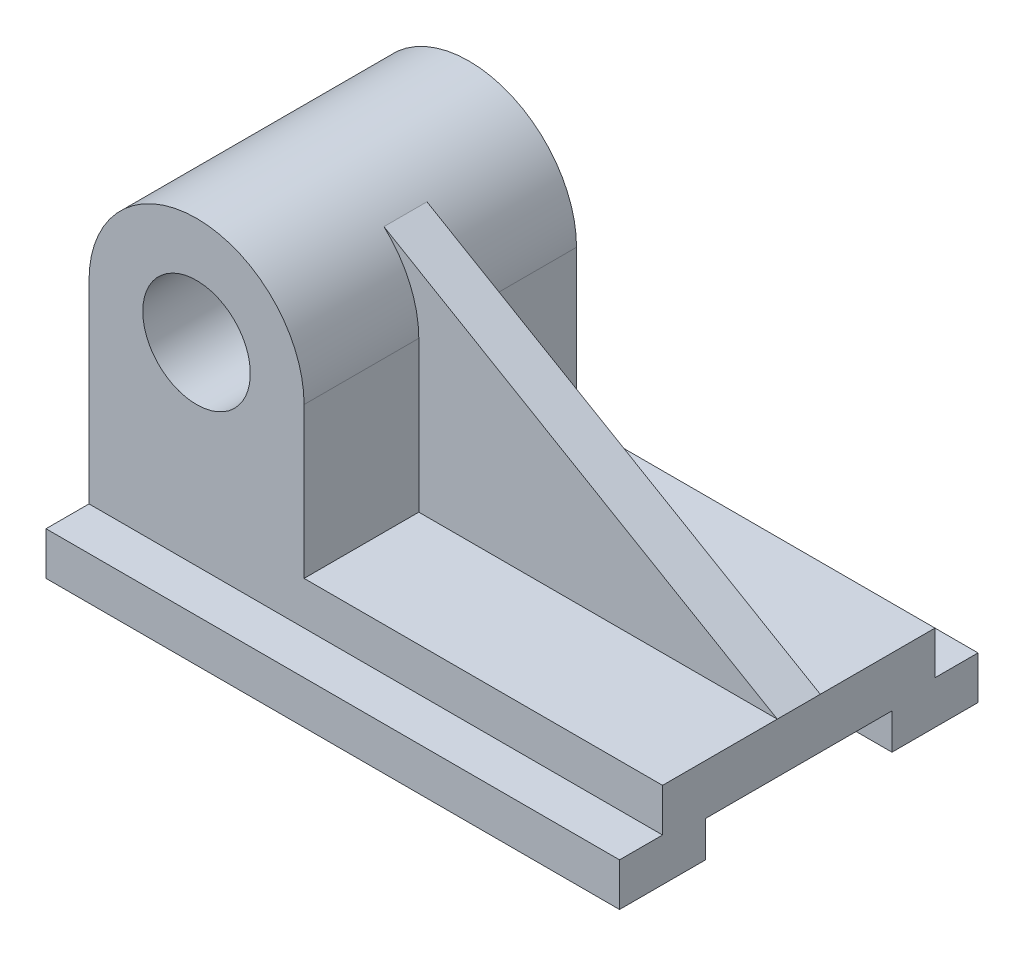
ISO-10303-21;
HEADER;
FILE_DESCRIPTION(('STEP AP214'),'2;1');
FILE_NAME('part.step','',(''),(''),'','','');
FILE_SCHEMA(('AUTOMOTIVE_DESIGN { 1 0 10303 214 1 1 1 1 }'));
ENDSEC;
DATA;
#1=APPLICATION_CONTEXT('core data for automotive mechanical design processes');
#2=APPLICATION_PROTOCOL_DEFINITION('international standard','automotive_design',2000,#1);
#3=PRODUCT_CONTEXT('',#1,'mechanical');
#4=PRODUCT('Part','Part','',(#3));
#5=PRODUCT_RELATED_PRODUCT_CATEGORY('part','',(#4));
#6=PRODUCT_DEFINITION_FORMATION('','',#4);
#7=PRODUCT_DEFINITION_CONTEXT('part definition',#1,'design');
#8=PRODUCT_DEFINITION('design','',#6,#7);
#9=PRODUCT_DEFINITION_SHAPE('','',#8);
#10=(LENGTH_UNIT() NAMED_UNIT(*) SI_UNIT(.MILLI.,.METRE.));
#11=(NAMED_UNIT(*) PLANE_ANGLE_UNIT() SI_UNIT($,.RADIAN.));
#12=(NAMED_UNIT(*) SI_UNIT($,.STERADIAN.) SOLID_ANGLE_UNIT());
#13=UNCERTAINTY_MEASURE_WITH_UNIT(LENGTH_MEASURE(1.E-05),#10,'distance_accuracy_value','');
#14=(GEOMETRIC_REPRESENTATION_CONTEXT(3) GLOBAL_UNCERTAINTY_ASSIGNED_CONTEXT((#13)) GLOBAL_UNIT_ASSIGNED_CONTEXT((#10,
#11,#12)) REPRESENTATION_CONTEXT('',''));
#15=CARTESIAN_POINT('',(0.,0.,0.));
#16=DIRECTION('',(0.,0.,1.));
#17=DIRECTION('',(1.,0.,0.));
#18=AXIS2_PLACEMENT_3D('',#15,#16,#17);
#19=CARTESIAN_POINT('',(0.,24.,0.));
#20=DIRECTION('',(0.,1.,0.));
#21=DIRECTION('',(0.,0.,1.));
#22=AXIS2_PLACEMENT_3D('',#19,#20,#21);
#23=PLANE('',#22);
#24=DIRECTION('',(0.,0.,-1.));
#25=VECTOR('',#24,1.);
#26=CARTESIAN_POINT('',(-20.,24.,38.));
#27=LINE('',#26,#25);
#28=CARTESIAN_POINT('',(-20.,24.,-6.));
#29=VERTEX_POINT('',#28);
#30=CARTESIAN_POINT('',(-20.,24.,-38.));
#31=VERTEX_POINT('',#30);
#32=EDGE_CURVE('E170',#29,#31,#27,.T.);
#33=ORIENTED_EDGE('',*,*,#32,.F.);
#34=DIRECTION('',(1.,0.,0.));
#35=VECTOR('',#34,1.);
#36=CARTESIAN_POINT('',(-20.,24.,-6.));
#37=LINE('',#36,#35);
#38=CARTESIAN_POINT('',(80.,24.,-6.));
#39=VERTEX_POINT('',#38);
#40=EDGE_CURVE('E48',#29,#39,#37,.T.);
#41=ORIENTED_EDGE('',*,*,#40,.T.);
#42=DIRECTION('',(0.,0.,-1.));
#43=VECTOR('',#42,1.);
#44=CARTESIAN_POINT('',(80.,24.,-50.));
#45=LINE('',#44,#43);
#46=CARTESIAN_POINT('',(80.,24.,-38.));
#47=VERTEX_POINT('',#46);
#48=EDGE_CURVE('E286',#39,#47,#45,.T.);
#49=ORIENTED_EDGE('',*,*,#48,.T.);
#50=DIRECTION('',(1.,0.,0.));
#51=VECTOR('',#50,1.);
#52=CARTESIAN_POINT('',(-80.,24.,-38.));
#53=LINE('',#52,#51);
#54=EDGE_CURVE('E245',#31,#47,#53,.T.);
#55=ORIENTED_EDGE('',*,*,#54,.F.);
#56=EDGE_LOOP('',(#33,#41,#49,#55));
#57=FACE_BOUND('',#56,.T.);
#58=ADVANCED_FACE('F33',(#57),#23,.T.);
#59=CARTESIAN_POINT('',(-20.,24.,38.));
#60=DIRECTION('',(1.,0.,0.));
#61=DIRECTION('',(0.,0.,-1.));
#62=AXIS2_PLACEMENT_3D('',#59,#60,#61);
#63=PLANE('',#62);
#64=DIRECTION('',(0.,0.,-1.));
#65=VECTOR('',#64,1.);
#66=CARTESIAN_POINT('',(-20.,66.,38.));
#67=LINE('',#66,#65);
#68=CARTESIAN_POINT('',(-20.,66.,-6.));
#69=VERTEX_POINT('',#68);
#70=CARTESIAN_POINT('',(-20.,66.,-38.));
#71=VERTEX_POINT('',#70);
#72=EDGE_CURVE('E171',#69,#71,#67,.T.);
#73=ORIENTED_EDGE('',*,*,#72,.F.);
#74=DIRECTION('',(0.,-1.,0.));
#75=VECTOR('',#74,1.);
#76=CARTESIAN_POINT('',(-20.,66.,-6.));
#77=LINE('',#76,#75);
#78=EDGE_CURVE('E186',#69,#29,#77,.T.);
#79=ORIENTED_EDGE('',*,*,#78,.T.);
#80=ORIENTED_EDGE('',*,*,#32,.T.);
#81=DIRECTION('',(0.,-1.,0.));
#82=VECTOR('',#81,1.);
#83=CARTESIAN_POINT('',(-20.,24.,-38.));
#84=LINE('',#83,#82);
#85=EDGE_CURVE('E210',#71,#31,#84,.T.);
#86=ORIENTED_EDGE('',*,*,#85,.F.);
#87=EDGE_LOOP('',(#73,#79,#80,#86));
#88=FACE_BOUND('',#87,.T.);
#89=ADVANCED_FACE('F358',(#88),#63,.T.);
#90=CARTESIAN_POINT('',(-50.,66.,38.));
#91=DIRECTION('',(0.,0.,-1.));
#92=DIRECTION('',(-1.,0.,0.));
#93=AXIS2_PLACEMENT_3D('',#90,#91,#92);
#94=CYLINDRICAL_SURFACE('',#93,30.);
#95=DIRECTION('',(0.,0.,1.));
#96=VECTOR('',#95,1.);
#97=CARTESIAN_POINT('',(-29.7283888855306,88.1147413013067,-6.));
#98=LINE('',#97,#96);
#99=CARTESIAN_POINT('',(-29.7283888855306,88.1147413013067,-6.));
#100=VERTEX_POINT('',#99);
#101=CARTESIAN_POINT('',(-29.7283888855306,88.1147413013068,6.));
#102=VERTEX_POINT('',#101);
#103=EDGE_CURVE('E198',#100,#102,#98,.T.);
#104=ORIENTED_EDGE('',*,*,#103,.F.);
#105=CARTESIAN_POINT('',(-50.,66.,-6.));
#106=DIRECTION('',(0.,0.,-1.));
#107=DIRECTION('',(1.,0.,0.));
#108=AXIS2_PLACEMENT_3D('',#105,#106,#107);
#109=CIRCLE('',#108,30.);
#110=EDGE_CURVE('E196',#100,#69,#109,.T.);
#111=ORIENTED_EDGE('',*,*,#110,.T.);
#112=ORIENTED_EDGE('',*,*,#72,.T.);
#113=CARTESIAN_POINT('',(-50.,66.,-38.));
#114=DIRECTION('',(0.,0.,-1.));
#115=DIRECTION('',(-1.,0.,0.));
#116=AXIS2_PLACEMENT_3D('',#113,#114,#115);
#117=CIRCLE('',#116,30.);
#118=CARTESIAN_POINT('',(-80.,66.,-38.));
#119=VERTEX_POINT('',#118);
#120=EDGE_CURVE('E205',#119,#71,#117,.T.);
#121=ORIENTED_EDGE('',*,*,#120,.F.);
#122=DIRECTION('',(0.,0.,-1.));
#123=VECTOR('',#122,1.);
#124=CARTESIAN_POINT('',(-80.,66.,38.));
#125=LINE('',#124,#123);
#126=CARTESIAN_POINT('',(-80.,66.,38.));
#127=VERTEX_POINT('',#126);
#128=EDGE_CURVE('E212',#127,#119,#125,.T.);
#129=ORIENTED_EDGE('',*,*,#128,.F.);
#130=CARTESIAN_POINT('',(-50.,66.,38.));
#131=DIRECTION('',(0.,0.,-1.));
#132=DIRECTION('',(-1.,0.,0.));
#133=AXIS2_PLACEMENT_3D('',#130,#131,#132);
#134=CIRCLE('',#133,30.);
#135=CARTESIAN_POINT('',(-20.,66.,38.));
#136=VERTEX_POINT('',#135);
#137=EDGE_CURVE('E166',#127,#136,#134,.T.);
#138=ORIENTED_EDGE('',*,*,#137,.T.);
#139=CARTESIAN_POINT('',(-20.,66.,6.));
#140=VERTEX_POINT('',#139);
#141=EDGE_CURVE('E158',#136,#140,#67,.T.);
#142=ORIENTED_EDGE('',*,*,#141,.T.);
#143=CARTESIAN_POINT('',(-50.,66.,6.));
#144=DIRECTION('',(0.,0.,-1.));
#145=DIRECTION('',(1.,0.,0.));
#146=AXIS2_PLACEMENT_3D('',#143,#144,#145);
#147=CIRCLE('',#146,30.);
#148=EDGE_CURVE('E162',#102,#140,#147,.T.);
#149=ORIENTED_EDGE('',*,*,#148,.F.);
#150=EDGE_LOOP('',(#104,#111,#112,#121,#129,#138,#142,#149));
#151=FACE_BOUND('',#150,.T.);
#152=ADVANCED_FACE('F160',(#151),#94,.T.);
#153=CARTESIAN_POINT('',(0.,0.,0.));
#154=DIRECTION('',(0.,1.,0.));
#155=DIRECTION('',(0.,0.,1.));
#156=AXIS2_PLACEMENT_3D('',#153,#154,#155);
#157=PLANE('',#156);
#158=DIRECTION('',(0.,0.,-1.));
#159=VECTOR('',#158,1.);
#160=CARTESIAN_POINT('',(80.,0.,-50.));
#161=LINE('',#160,#159);
#162=CARTESIAN_POINT('',(80.,0.,-26.));
#163=VERTEX_POINT('',#162);
#164=CARTESIAN_POINT('',(80.,0.,-50.));
#165=VERTEX_POINT('',#164);
#166=EDGE_CURVE('E276',#163,#165,#161,.T.);
#167=ORIENTED_EDGE('',*,*,#166,.F.);
#168=DIRECTION('',(1.,0.,0.));
#169=VECTOR('',#168,1.);
#170=CARTESIAN_POINT('',(-80.,0.,-26.));
#171=LINE('',#170,#169);
#172=CARTESIAN_POINT('',(-80.,0.,-26.));
#173=VERTEX_POINT('',#172);
#174=EDGE_CURVE('E274',#173,#163,#171,.T.);
#175=ORIENTED_EDGE('',*,*,#174,.F.);
#176=DIRECTION('',(0.,0.,1.));
#177=VECTOR('',#176,1.);
#178=CARTESIAN_POINT('',(-80.,0.,-50.));
#179=LINE('',#178,#177);
#180=CARTESIAN_POINT('',(-80.,0.,-50.));
#181=VERTEX_POINT('',#180);
#182=EDGE_CURVE('E294',#181,#173,#179,.T.);
#183=ORIENTED_EDGE('',*,*,#182,.F.);
#184=DIRECTION('',(-1.,0.,0.));
#185=VECTOR('',#184,1.);
#186=CARTESIAN_POINT('',(-80.,0.,-50.));
#187=LINE('',#186,#185);
#188=EDGE_CURVE('E290',#165,#181,#187,.T.);
#189=ORIENTED_EDGE('',*,*,#188,.F.);
#190=EDGE_LOOP('',(#167,#175,#183,#189));
#191=FACE_BOUND('',#190,.T.);
#192=ADVANCED_FACE('F315',(#191),#157,.F.);
#193=CARTESIAN_POINT('',(80.,24.,-50.));
#194=DIRECTION('',(-1.,0.,0.));
#195=DIRECTION('',(0.,0.,1.));
#196=AXIS2_PLACEMENT_3D('',#193,#194,#195);
#197=PLANE('',#196);
#198=CARTESIAN_POINT('',(80.,24.,38.));
#199=VERTEX_POINT('',#198);
#200=CARTESIAN_POINT('',(80.,24.,6.));
#201=VERTEX_POINT('',#200);
#202=EDGE_CURVE('E283',#199,#201,#45,.T.);
#203=ORIENTED_EDGE('',*,*,#202,.F.);
#204=DIRECTION('',(0.,1.,0.));
#205=VECTOR('',#204,1.);
#206=CARTESIAN_POINT('',(80.,24.,38.));
#207=LINE('',#206,#205);
#208=CARTESIAN_POINT('',(80.,12.,38.));
#209=VERTEX_POINT('',#208);
#210=EDGE_CURVE('E225',#209,#199,#207,.T.);
#211=ORIENTED_EDGE('',*,*,#210,.F.);
#212=DIRECTION('',(0.,0.,-1.));
#213=VECTOR('',#212,1.);
#214=CARTESIAN_POINT('',(80.,12.,50.));
#215=LINE('',#214,#213);
#216=CARTESIAN_POINT('',(80.,12.,50.));
#217=VERTEX_POINT('',#216);
#218=EDGE_CURVE('E217',#217,#209,#215,.T.);
#219=ORIENTED_EDGE('',*,*,#218,.F.);
#220=DIRECTION('',(0.,-1.,0.));
#221=VECTOR('',#220,1.);
#222=CARTESIAN_POINT('',(80.,24.,50.));
#223=LINE('',#222,#221);
#224=CARTESIAN_POINT('',(80.,0.,50.));
#225=VERTEX_POINT('',#224);
#226=EDGE_CURVE('E285',#217,#225,#223,.T.);
#227=ORIENTED_EDGE('',*,*,#226,.T.);
#228=CARTESIAN_POINT('',(80.,0.,26.));
#229=VERTEX_POINT('',#228);
#230=EDGE_CURVE('E287',#225,#229,#161,.T.);
#231=ORIENTED_EDGE('',*,*,#230,.T.);
#232=DIRECTION('',(0.,-1.,0.));
#233=VECTOR('',#232,1.);
#234=CARTESIAN_POINT('',(80.,10.,26.));
#235=LINE('',#234,#233);
#236=CARTESIAN_POINT('',(80.,10.,26.));
#237=VERTEX_POINT('',#236);
#238=EDGE_CURVE('E261',#237,#229,#235,.T.);
#239=ORIENTED_EDGE('',*,*,#238,.F.);
#240=DIRECTION('',(0.,0.,1.));
#241=VECTOR('',#240,1.);
#242=CARTESIAN_POINT('',(80.,10.,26.));
#243=LINE('',#242,#241);
#244=CARTESIAN_POINT('',(80.,10.,-26.));
#245=VERTEX_POINT('',#244);
#246=EDGE_CURVE('E270',#245,#237,#243,.T.);
#247=ORIENTED_EDGE('',*,*,#246,.F.);
#248=DIRECTION('',(0.,1.,0.));
#249=VECTOR('',#248,1.);
#250=CARTESIAN_POINT('',(80.,10.,-26.));
#251=LINE('',#250,#249);
#252=EDGE_CURVE('E252',#163,#245,#251,.T.);
#253=ORIENTED_EDGE('',*,*,#252,.F.);
#254=ORIENTED_EDGE('',*,*,#166,.T.);
#255=DIRECTION('',(0.,-1.,0.));
#256=VECTOR('',#255,1.);
#257=CARTESIAN_POINT('',(80.,24.,-50.));
#258=LINE('',#257,#256);
#259=CARTESIAN_POINT('',(80.,12.,-50.));
#260=VERTEX_POINT('',#259);
#261=EDGE_CURVE('E11',#260,#165,#258,.T.);
#262=ORIENTED_EDGE('',*,*,#261,.F.);
#263=DIRECTION('',(0.,0.,-1.));
#264=VECTOR('',#263,1.);
#265=CARTESIAN_POINT('',(80.,12.,-50.));
#266=LINE('',#265,#264);
#267=CARTESIAN_POINT('',(80.,12.,-38.));
#268=VERTEX_POINT('',#267);
#269=EDGE_CURVE('E242',#268,#260,#266,.T.);
#270=ORIENTED_EDGE('',*,*,#269,.F.);
#271=DIRECTION('',(0.,-1.,0.));
#272=VECTOR('',#271,1.);
#273=CARTESIAN_POINT('',(80.,24.,-38.));
#274=LINE('',#273,#272);
#275=EDGE_CURVE('E234',#47,#268,#274,.T.);
#276=ORIENTED_EDGE('',*,*,#275,.F.);
#277=ORIENTED_EDGE('',*,*,#48,.F.);
#278=DIRECTION('',(0.,0.,1.));
#279=VECTOR('',#278,1.);
#280=CARTESIAN_POINT('',(80.,24.,-6.));
#281=LINE('',#280,#279);
#282=EDGE_CURVE('E55',#39,#201,#281,.T.);
#283=ORIENTED_EDGE('',*,*,#282,.T.);
#284=EDGE_LOOP('',(#203,#211,#219,#227,#231,#239,#247,#253,#254,#262,#270,#276,#277,#283));
#285=FACE_BOUND('',#284,.T.);
#286=ADVANCED_FACE('F35',(#285),#197,.F.);
#287=CARTESIAN_POINT('',(-80.,24.,-50.));
#288=DIRECTION('',(0.,0.,1.));
#289=DIRECTION('',(1.,0.,0.));
#290=AXIS2_PLACEMENT_3D('',#287,#288,#289);
#291=PLANE('',#290);
#292=DIRECTION('',(0.,-1.,0.));
#293=VECTOR('',#292,1.);
#294=CARTESIAN_POINT('',(-80.,24.,-50.));
#295=LINE('',#294,#293);
#296=CARTESIAN_POINT('',(-80.,12.,-50.));
#297=VERTEX_POINT('',#296);
#298=EDGE_CURVE('E41',#297,#181,#295,.T.);
#299=ORIENTED_EDGE('',*,*,#298,.F.);
#300=DIRECTION('',(1.,0.,0.));
#301=VECTOR('',#300,1.);
#302=CARTESIAN_POINT('',(-80.,12.,-50.));
#303=LINE('',#302,#301);
#304=EDGE_CURVE('E249',#297,#260,#303,.T.);
#305=ORIENTED_EDGE('',*,*,#304,.T.);
#306=ORIENTED_EDGE('',*,*,#261,.T.);
#307=ORIENTED_EDGE('',*,*,#188,.T.);
#308=EDGE_LOOP('',(#299,#305,#306,#307));
#309=FACE_BOUND('',#308,.T.);
#310=ADVANCED_FACE('F309',(#309),#291,.F.);
#311=CARTESIAN_POINT('',(-80.,24.,-50.));
#312=DIRECTION('',(1.,0.,0.));
#313=DIRECTION('',(0.,0.,-1.));
#314=AXIS2_PLACEMENT_3D('',#311,#312,#313);
#315=PLANE('',#314);
#316=DIRECTION('',(0.,0.,-1.));
#317=VECTOR('',#316,1.);
#318=CARTESIAN_POINT('',(-80.,12.,50.));
#319=LINE('',#318,#317);
#320=CARTESIAN_POINT('',(-80.,12.,50.));
#321=VERTEX_POINT('',#320);
#322=CARTESIAN_POINT('',(-80.,12.,38.));
#323=VERTEX_POINT('',#322);
#324=EDGE_CURVE('E221',#321,#323,#319,.T.);
#325=ORIENTED_EDGE('',*,*,#324,.T.);
#326=DIRECTION('',(0.,1.,0.));
#327=VECTOR('',#326,1.);
#328=CARTESIAN_POINT('',(-80.,24.,38.));
#329=LINE('',#328,#327);
#330=EDGE_CURVE('E224',#323,#127,#329,.T.);
#331=ORIENTED_EDGE('',*,*,#330,.T.);
#332=ORIENTED_EDGE('',*,*,#128,.T.);
#333=DIRECTION('',(0.,-1.,0.));
#334=VECTOR('',#333,1.);
#335=CARTESIAN_POINT('',(-80.,24.,-38.));
#336=LINE('',#335,#334);
#337=CARTESIAN_POINT('',(-80.,12.,-38.));
#338=VERTEX_POINT('',#337);
#339=EDGE_CURVE('E238',#119,#338,#336,.T.);
#340=ORIENTED_EDGE('',*,*,#339,.T.);
#341=DIRECTION('',(0.,0.,-1.));
#342=VECTOR('',#341,1.);
#343=CARTESIAN_POINT('',(-80.,12.,-50.));
#344=LINE('',#343,#342);
#345=EDGE_CURVE('E241',#338,#297,#344,.T.);
#346=ORIENTED_EDGE('',*,*,#345,.T.);
#347=ORIENTED_EDGE('',*,*,#298,.T.);
#348=ORIENTED_EDGE('',*,*,#182,.T.);
#349=DIRECTION('',(0.,1.,0.));
#350=VECTOR('',#349,1.);
#351=CARTESIAN_POINT('',(-80.,10.,-26.));
#352=LINE('',#351,#350);
#353=CARTESIAN_POINT('',(-80.,10.,-26.));
#354=VERTEX_POINT('',#353);
#355=EDGE_CURVE('E257',#173,#354,#352,.T.);
#356=ORIENTED_EDGE('',*,*,#355,.T.);
#357=DIRECTION('',(0.,0.,1.));
#358=VECTOR('',#357,1.);
#359=CARTESIAN_POINT('',(-80.,10.,26.));
#360=LINE('',#359,#358);
#361=CARTESIAN_POINT('',(-80.,10.,26.));
#362=VERTEX_POINT('',#361);
#363=EDGE_CURVE('E260',#354,#362,#360,.T.);
#364=ORIENTED_EDGE('',*,*,#363,.T.);
#365=DIRECTION('',(0.,-1.,0.));
#366=VECTOR('',#365,1.);
#367=CARTESIAN_POINT('',(-80.,10.,26.));
#368=LINE('',#367,#366);
#369=CARTESIAN_POINT('',(-80.,0.,26.));
#370=VERTEX_POINT('',#369);
#371=EDGE_CURVE('E264',#362,#370,#368,.T.);
#372=ORIENTED_EDGE('',*,*,#371,.T.);
#373=CARTESIAN_POINT('',(-80.,0.,50.));
#374=VERTEX_POINT('',#373);
#375=EDGE_CURVE('E293',#370,#374,#179,.T.);
#376=ORIENTED_EDGE('',*,*,#375,.T.);
#377=DIRECTION('',(0.,-1.,0.));
#378=VECTOR('',#377,1.);
#379=CARTESIAN_POINT('',(-80.,24.,50.));
#380=LINE('',#379,#378);
#381=EDGE_CURVE('E301',#321,#374,#380,.T.);
#382=ORIENTED_EDGE('',*,*,#381,.F.);
#383=EDGE_LOOP('',(#325,#331,#332,#340,#346,#347,#348,#356,#364,#372,#376,#382));
#384=FACE_BOUND('',#383,.T.);
#385=ADVANCED_FACE('F304',(#384),#315,.F.);
#386=CARTESIAN_POINT('',(-80.,24.,50.));
#387=DIRECTION('',(0.,0.,-1.));
#388=DIRECTION('',(-1.,0.,0.));
#389=AXIS2_PLACEMENT_3D('',#386,#387,#388);
#390=PLANE('',#389);
#391=ORIENTED_EDGE('',*,*,#226,.F.);
#392=DIRECTION('',(1.,0.,0.));
#393=VECTOR('',#392,1.);
#394=CARTESIAN_POINT('',(-80.,12.,50.));
#395=LINE('',#394,#393);
#396=EDGE_CURVE('E227',#321,#217,#395,.T.);
#397=ORIENTED_EDGE('',*,*,#396,.F.);
#398=ORIENTED_EDGE('',*,*,#381,.T.);
#399=DIRECTION('',(1.,0.,0.));
#400=VECTOR('',#399,1.);
#401=CARTESIAN_POINT('',(-80.,0.,50.));
#402=LINE('',#401,#400);
#403=EDGE_CURVE('E297',#374,#225,#402,.T.);
#404=ORIENTED_EDGE('',*,*,#403,.T.);
#405=EDGE_LOOP('',(#391,#397,#398,#404));
#406=FACE_BOUND('',#405,.T.);
#407=ADVANCED_FACE('F335',(#406),#390,.F.);
#408=DIRECTION('',(1.,0.,0.));
#409=VECTOR('',#408,1.);
#410=CARTESIAN_POINT('',(-20.,24.,6.));
#411=LINE('',#410,#409);
#412=CARTESIAN_POINT('',(-20.,24.,6.));
#413=VERTEX_POINT('',#412);
#414=EDGE_CURVE('E180',#413,#201,#411,.T.);
#415=ORIENTED_EDGE('',*,*,#414,.F.);
#416=CARTESIAN_POINT('',(-20.,24.,38.));
#417=VERTEX_POINT('',#416);
#418=EDGE_CURVE('E177',#417,#413,#27,.T.);
#419=ORIENTED_EDGE('',*,*,#418,.F.);
#420=DIRECTION('',(1.,0.,0.));
#421=VECTOR('',#420,1.);
#422=CARTESIAN_POINT('',(-80.,24.,38.));
#423=LINE('',#422,#421);
#424=EDGE_CURVE('E232',#417,#199,#423,.T.);
#425=ORIENTED_EDGE('',*,*,#424,.T.);
#426=ORIENTED_EDGE('',*,*,#202,.T.);
#427=EDGE_LOOP('',(#415,#419,#425,#426));
#428=FACE_BOUND('',#427,.T.);
#429=ADVANCED_FACE('F347',(#428),#23,.T.);
#430=ORIENTED_EDGE('',*,*,#375,.F.);
#431=DIRECTION('',(1.,0.,0.));
#432=VECTOR('',#431,1.);
#433=CARTESIAN_POINT('',(-80.,0.,26.));
#434=LINE('',#433,#432);
#435=EDGE_CURVE('E277',#370,#229,#434,.T.);
#436=ORIENTED_EDGE('',*,*,#435,.T.);
#437=ORIENTED_EDGE('',*,*,#230,.F.);
#438=ORIENTED_EDGE('',*,*,#403,.F.);
#439=EDGE_LOOP('',(#430,#436,#437,#438));
#440=FACE_BOUND('',#439,.T.);
#441=ADVANCED_FACE('F331',(#440),#157,.F.);
#442=CARTESIAN_POINT('',(-80.,10.,-26.));
#443=DIRECTION('',(0.,0.,-1.));
#444=DIRECTION('',(-1.,0.,0.));
#445=AXIS2_PLACEMENT_3D('',#442,#443,#444);
#446=PLANE('',#445);
#447=ORIENTED_EDGE('',*,*,#252,.T.);
#448=DIRECTION('',(1.,0.,0.));
#449=VECTOR('',#448,1.);
#450=CARTESIAN_POINT('',(-80.,10.,-26.));
#451=LINE('',#450,#449);
#452=EDGE_CURVE('E267',#354,#245,#451,.T.);
#453=ORIENTED_EDGE('',*,*,#452,.F.);
#454=ORIENTED_EDGE('',*,*,#355,.F.);
#455=ORIENTED_EDGE('',*,*,#174,.T.);
#456=EDGE_LOOP('',(#447,#453,#454,#455));
#457=FACE_BOUND('',#456,.T.);
#458=ADVANCED_FACE('F318',(#457),#446,.F.);
#459=CARTESIAN_POINT('',(-80.,10.,26.));
#460=DIRECTION('',(0.,0.,1.));
#461=DIRECTION('',(0.,-1.,0.));
#462=AXIS2_PLACEMENT_3D('',#459,#460,#461);
#463=PLANE('',#462);
#464=ORIENTED_EDGE('',*,*,#238,.T.);
#465=ORIENTED_EDGE('',*,*,#435,.F.);
#466=ORIENTED_EDGE('',*,*,#371,.F.);
#467=DIRECTION('',(1.,0.,0.));
#468=VECTOR('',#467,1.);
#469=CARTESIAN_POINT('',(-80.,10.,26.));
#470=LINE('',#469,#468);
#471=EDGE_CURVE('E280',#362,#237,#470,.T.);
#472=ORIENTED_EDGE('',*,*,#471,.T.);
#473=EDGE_LOOP('',(#464,#465,#466,#472));
#474=FACE_BOUND('',#473,.T.);
#475=ADVANCED_FACE('F414',(#474),#463,.F.);
#476=CARTESIAN_POINT('',(-80.,10.,26.));
#477=DIRECTION('',(0.,1.,0.));
#478=DIRECTION('',(0.,0.,1.));
#479=AXIS2_PLACEMENT_3D('',#476,#477,#478);
#480=PLANE('',#479);
#481=ORIENTED_EDGE('',*,*,#246,.T.);
#482=ORIENTED_EDGE('',*,*,#471,.F.);
#483=ORIENTED_EDGE('',*,*,#363,.F.);
#484=ORIENTED_EDGE('',*,*,#452,.T.);
#485=EDGE_LOOP('',(#481,#482,#483,#484));
#486=FACE_BOUND('',#485,.T.);
#487=ADVANCED_FACE('F322',(#486),#480,.F.);
#488=CARTESIAN_POINT('',(-80.,12.,-50.));
#489=DIRECTION('',(0.,-1.,0.));
#490=DIRECTION('',(0.,0.,-1.));
#491=AXIS2_PLACEMENT_3D('',#488,#489,#490);
#492=PLANE('',#491);
#493=ORIENTED_EDGE('',*,*,#269,.T.);
#494=ORIENTED_EDGE('',*,*,#304,.F.);
#495=ORIENTED_EDGE('',*,*,#345,.F.);
#496=DIRECTION('',(1.,0.,0.));
#497=VECTOR('',#496,1.);
#498=CARTESIAN_POINT('',(-80.,12.,-38.));
#499=LINE('',#498,#497);
#500=EDGE_CURVE('E253',#338,#268,#499,.T.);
#501=ORIENTED_EDGE('',*,*,#500,.T.);
#502=EDGE_LOOP('',(#493,#494,#495,#501));
#503=FACE_BOUND('',#502,.T.);
#504=ADVANCED_FACE('F407',(#503),#492,.F.);
#505=CARTESIAN_POINT('',(-80.,24.,-38.));
#506=DIRECTION('',(0.,0.,1.));
#507=DIRECTION('',(1.,0.,0.));
#508=AXIS2_PLACEMENT_3D('',#505,#506,#507);
#509=PLANE('',#508);
#510=ORIENTED_EDGE('',*,*,#275,.T.);
#511=ORIENTED_EDGE('',*,*,#500,.F.);
#512=ORIENTED_EDGE('',*,*,#339,.F.);
#513=ORIENTED_EDGE('',*,*,#120,.T.);
#514=ORIENTED_EDGE('',*,*,#85,.T.);
#515=ORIENTED_EDGE('',*,*,#54,.T.);
#516=EDGE_LOOP('',(#510,#511,#512,#513,#514,#515));
#517=FACE_BOUND('',#516,.T.);
#518=CARTESIAN_POINT('',(-50.,66.,-38.));
#519=DIRECTION('',(0.,0.,-1.));
#520=DIRECTION('',(-1.,0.,0.));
#521=AXIS2_PLACEMENT_3D('',#518,#519,#520);
#522=CIRCLE('',#521,15.);
#523=CARTESIAN_POINT('',(-65.,66.,-38.));
#524=VERTEX_POINT('',#523);
#525=EDGE_CURVE('E200',#524,#524,#522,.T.);
#526=ORIENTED_EDGE('',*,*,#525,.F.);
#527=EDGE_LOOP('',(#526));
#528=FACE_BOUND('',#527,.T.);
#529=ADVANCED_FACE('F404',(#517,#528),#509,.F.);
#530=CARTESIAN_POINT('',(-80.,24.,38.));
#531=DIRECTION('',(0.,0.,-1.));
#532=DIRECTION('',(-1.,0.,0.));
#533=AXIS2_PLACEMENT_3D('',#530,#531,#532);
#534=PLANE('',#533);
#535=ORIENTED_EDGE('',*,*,#210,.T.);
#536=ORIENTED_EDGE('',*,*,#424,.F.);
#537=DIRECTION('',(0.,-1.,0.));
#538=VECTOR('',#537,1.);
#539=CARTESIAN_POINT('',(-20.,24.,38.));
#540=LINE('',#539,#538);
#541=EDGE_CURVE('E209',#136,#417,#540,.T.);
#542=ORIENTED_EDGE('',*,*,#541,.F.);
#543=ORIENTED_EDGE('',*,*,#137,.F.);
#544=ORIENTED_EDGE('',*,*,#330,.F.);
#545=DIRECTION('',(1.,0.,0.));
#546=VECTOR('',#545,1.);
#547=CARTESIAN_POINT('',(-80.,12.,38.));
#548=LINE('',#547,#546);
#549=EDGE_CURVE('E235',#323,#209,#548,.T.);
#550=ORIENTED_EDGE('',*,*,#549,.T.);
#551=EDGE_LOOP('',(#535,#536,#542,#543,#544,#550));
#552=FACE_BOUND('',#551,.T.);
#553=CARTESIAN_POINT('',(-50.,66.,38.));
#554=DIRECTION('',(0.,0.,-1.));
#555=DIRECTION('',(-1.,0.,0.));
#556=AXIS2_PLACEMENT_3D('',#553,#554,#555);
#557=CIRCLE('',#556,15.);
#558=CARTESIAN_POINT('',(-65.,66.,38.));
#559=VERTEX_POINT('',#558);
#560=EDGE_CURVE('E202',#559,#559,#557,.T.);
#561=ORIENTED_EDGE('',*,*,#560,.T.);
#562=EDGE_LOOP('',(#561));
#563=FACE_BOUND('',#562,.T.);
#564=ADVANCED_FACE('F343',(#552,#563),#534,.F.);
#565=CARTESIAN_POINT('',(-80.,12.,50.));
#566=DIRECTION('',(0.,-1.,0.));
#567=DIRECTION('',(0.,0.,-1.));
#568=AXIS2_PLACEMENT_3D('',#565,#566,#567);
#569=PLANE('',#568);
#570=ORIENTED_EDGE('',*,*,#218,.T.);
#571=ORIENTED_EDGE('',*,*,#549,.F.);
#572=ORIENTED_EDGE('',*,*,#324,.F.);
#573=ORIENTED_EDGE('',*,*,#396,.T.);
#574=EDGE_LOOP('',(#570,#571,#572,#573));
#575=FACE_BOUND('',#574,.T.);
#576=ADVANCED_FACE('F339',(#575),#569,.F.);
#577=DIRECTION('',(0.,-1.,0.));
#578=VECTOR('',#577,1.);
#579=CARTESIAN_POINT('',(-20.,66.,6.));
#580=LINE('',#579,#578);
#581=EDGE_CURVE('E175',#140,#413,#580,.T.);
#582=ORIENTED_EDGE('',*,*,#581,.F.);
#583=ORIENTED_EDGE('',*,*,#141,.F.);
#584=ORIENTED_EDGE('',*,*,#541,.T.);
#585=ORIENTED_EDGE('',*,*,#418,.T.);
#586=EDGE_LOOP('',(#582,#583,#584,#585));
#587=FACE_BOUND('',#586,.T.);
#588=ADVANCED_FACE('F176',(#587),#63,.T.);
#589=CARTESIAN_POINT('',(-50.,66.,38.));
#590=DIRECTION('',(0.,0.,-1.));
#591=DIRECTION('',(-1.,0.,0.));
#592=AXIS2_PLACEMENT_3D('',#589,#590,#591);
#593=CYLINDRICAL_SURFACE('',#592,15.);
#594=ORIENTED_EDGE('',*,*,#560,.F.);
#595=EDGE_LOOP('',(#594));
#596=FACE_BOUND('',#595,.T.);
#597=ORIENTED_EDGE('',*,*,#525,.T.);
#598=EDGE_LOOP('',(#597));
#599=FACE_BOUND('',#598,.T.);
#600=ADVANCED_FACE('F367',(#596,#599),#593,.F.);
#601=CARTESIAN_POINT('',(80.,24.,-6.));
#602=DIRECTION('',(0.50449622993948,0.863413894940805,0.));
#603=DIRECTION('',(-0.863413894940805,0.50449622993948,0.));
#604=AXIS2_PLACEMENT_3D('',#601,#602,#603);
#605=PLANE('',#604);
#606=ORIENTED_EDGE('',*,*,#103,.T.);
#607=DIRECTION('',(-0.863413894940805,0.50449622993948,0.));
#608=VECTOR('',#607,1.);
#609=CARTESIAN_POINT('',(80.,24.,6.));
#610=LINE('',#609,#608);
#611=EDGE_CURVE('E185',#201,#102,#610,.T.);
#612=ORIENTED_EDGE('',*,*,#611,.F.);
#613=ORIENTED_EDGE('',*,*,#282,.F.);
#614=DIRECTION('',(-0.863413894940805,0.50449622993948,0.));
#615=VECTOR('',#614,1.);
#616=CARTESIAN_POINT('',(80.,24.,-6.));
#617=LINE('',#616,#615);
#618=EDGE_CURVE('E193',#39,#100,#617,.T.);
#619=ORIENTED_EDGE('',*,*,#618,.T.);
#620=EDGE_LOOP('',(#606,#612,#613,#619));
#621=FACE_BOUND('',#620,.T.);
#622=ADVANCED_FACE('F349',(#621),#605,.T.);
#623=CARTESIAN_POINT('',(-50.,66.,-6.));
#624=DIRECTION('',(0.,0.,1.));
#625=DIRECTION('',(1.,0.,0.));
#626=AXIS2_PLACEMENT_3D('',#623,#624,#625);
#627=PLANE('',#626);
#628=ORIENTED_EDGE('',*,*,#78,.F.);
#629=ORIENTED_EDGE('',*,*,#110,.F.);
#630=ORIENTED_EDGE('',*,*,#618,.F.);
#631=ORIENTED_EDGE('',*,*,#40,.F.);
#632=EDGE_LOOP('',(#628,#629,#630,#631));
#633=FACE_BOUND('',#632,.T.);
#634=ADVANCED_FACE('F359',(#633),#627,.F.);
#635=CARTESIAN_POINT('',(-50.,66.,6.));
#636=DIRECTION('',(0.,0.,1.));
#637=DIRECTION('',(1.,0.,0.));
#638=AXIS2_PLACEMENT_3D('',#635,#636,#637);
#639=PLANE('',#638);
#640=ORIENTED_EDGE('',*,*,#581,.T.);
#641=ORIENTED_EDGE('',*,*,#414,.T.);
#642=ORIENTED_EDGE('',*,*,#611,.T.);
#643=ORIENTED_EDGE('',*,*,#148,.T.);
#644=EDGE_LOOP('',(#640,#641,#642,#643));
#645=FACE_BOUND('',#644,.T.);
#646=ADVANCED_FACE('F183',(#645),#639,.T.);
#647=CLOSED_SHELL('',(#58,#89,#152,#192,#286,#310,#385,#407,#429,#441,#458,#475,#487,#504,#529,
#564,#576,#588,#600,#622,#634,#646));
#648=MANIFOLD_SOLID_BREP('B2',#647);
#649=ADVANCED_BREP_SHAPE_REPRESENTATION('',(#18,#648),#14);
#650=SHAPE_DEFINITION_REPRESENTATION(#9,#649);
ENDSEC;
END-ISO-10303-21;
